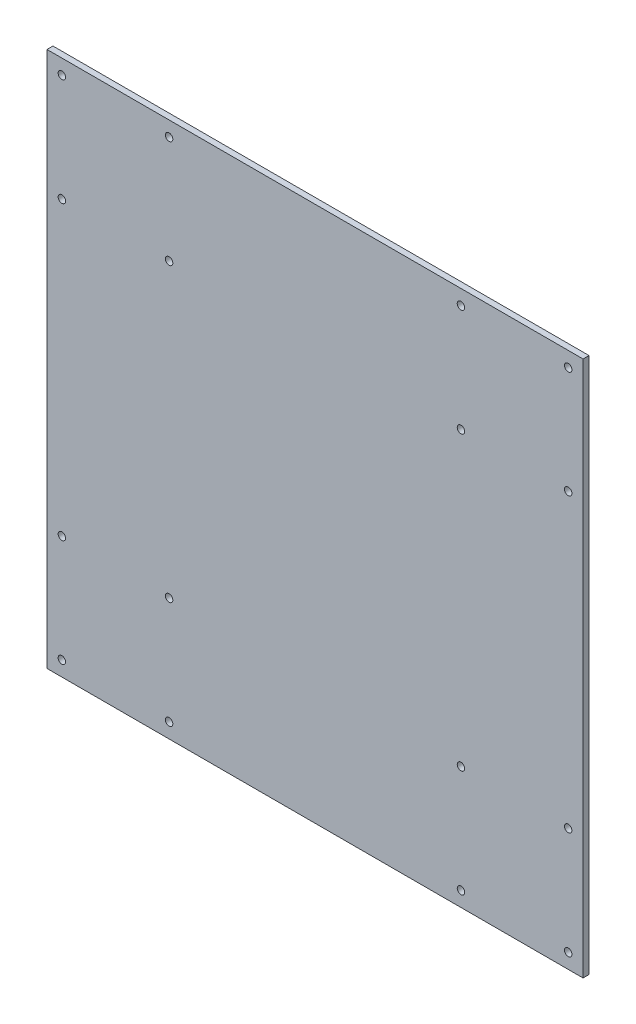
ISO-10303-21;
HEADER;
FILE_DESCRIPTION(('STEP AP214'),'2;1');
FILE_NAME('part.step','',(''),(''),'','','');
FILE_SCHEMA(('AUTOMOTIVE_DESIGN { 1 0 10303 214 1 1 1 1 }'));
ENDSEC;
DATA;
#1=APPLICATION_CONTEXT('core data for automotive mechanical design processes');
#2=APPLICATION_PROTOCOL_DEFINITION('international standard','automotive_design',2000,#1);
#3=PRODUCT_CONTEXT('',#1,'mechanical');
#4=PRODUCT('Part','Part','',(#3));
#5=PRODUCT_RELATED_PRODUCT_CATEGORY('part','',(#4));
#6=PRODUCT_DEFINITION_FORMATION('','',#4);
#7=PRODUCT_DEFINITION_CONTEXT('part definition',#1,'design');
#8=PRODUCT_DEFINITION('design','',#6,#7);
#9=PRODUCT_DEFINITION_SHAPE('','',#8);
#10=(LENGTH_UNIT() NAMED_UNIT(*) SI_UNIT(.MILLI.,.METRE.));
#11=(NAMED_UNIT(*) PLANE_ANGLE_UNIT() SI_UNIT($,.RADIAN.));
#12=(NAMED_UNIT(*) SI_UNIT($,.STERADIAN.) SOLID_ANGLE_UNIT());
#13=UNCERTAINTY_MEASURE_WITH_UNIT(LENGTH_MEASURE(1.E-05),#10,'distance_accuracy_value','');
#14=(GEOMETRIC_REPRESENTATION_CONTEXT(3) GLOBAL_UNCERTAINTY_ASSIGNED_CONTEXT((#13)) GLOBAL_UNIT_ASSIGNED_CONTEXT((#10,
#11,#12)) REPRESENTATION_CONTEXT('',''));
#15=CARTESIAN_POINT('',(0.,0.,0.));
#16=DIRECTION('',(0.,0.,1.));
#17=DIRECTION('',(1.,0.,0.));
#18=AXIS2_PLACEMENT_3D('',#15,#16,#17);
#19=CARTESIAN_POINT('',(0.,0.,0.));
#20=DIRECTION('',(0.,0.,-1.));
#21=DIRECTION('',(-1.,0.,0.));
#22=AXIS2_PLACEMENT_3D('',#19,#20,#21);
#23=PLANE('',#22);
#24=CARTESIAN_POINT('',(5.,41.,0.));
#25=DIRECTION('',(0.,0.,1.));
#26=DIRECTION('',(1.,0.,0.));
#27=AXIS2_PLACEMENT_3D('',#24,#25,#26);
#28=CIRCLE('',#27,1.24999999999999);
#29=CARTESIAN_POINT('',(6.24999999999999,41.,0.));
#30=VERTEX_POINT('',#29);
#31=EDGE_CURVE('E197',#30,#30,#28,.T.);
#32=ORIENTED_EDGE('',*,*,#31,.T.);
#33=EDGE_LOOP('',(#32));
#34=FACE_BOUND('',#33,.T.);
#35=CARTESIAN_POINT('',(41.,4.99999999999996,0.));
#36=DIRECTION('',(0.,0.,1.));
#37=DIRECTION('',(1.,0.,0.));
#38=AXIS2_PLACEMENT_3D('',#35,#36,#37);
#39=CIRCLE('',#38,1.24999999999999);
#40=CARTESIAN_POINT('',(42.25,4.99999999999996,0.));
#41=VERTEX_POINT('',#40);
#42=EDGE_CURVE('E185',#41,#41,#39,.T.);
#43=ORIENTED_EDGE('',*,*,#42,.T.);
#44=EDGE_LOOP('',(#43));
#45=FACE_BOUND('',#44,.T.);
#46=CARTESIAN_POINT('',(5.,139.,0.));
#47=DIRECTION('',(0.,0.,1.));
#48=DIRECTION('',(1.,0.,0.));
#49=AXIS2_PLACEMENT_3D('',#46,#47,#48);
#50=CIRCLE('',#49,1.24999999999999);
#51=CARTESIAN_POINT('',(6.24999999999999,139.,0.));
#52=VERTEX_POINT('',#51);
#53=EDGE_CURVE('E173',#52,#52,#50,.T.);
#54=ORIENTED_EDGE('',*,*,#53,.T.);
#55=EDGE_LOOP('',(#54));
#56=FACE_BOUND('',#55,.T.);
#57=CARTESIAN_POINT('',(41.,175.,0.));
#58=DIRECTION('',(0.,0.,1.));
#59=DIRECTION('',(1.,0.,0.));
#60=AXIS2_PLACEMENT_3D('',#57,#58,#59);
#61=CIRCLE('',#60,1.24999999999999);
#62=CARTESIAN_POINT('',(42.25,175.,0.));
#63=VERTEX_POINT('',#62);
#64=EDGE_CURVE('E161',#63,#63,#61,.T.);
#65=ORIENTED_EDGE('',*,*,#64,.T.);
#66=EDGE_LOOP('',(#65));
#67=FACE_BOUND('',#66,.T.);
#68=CARTESIAN_POINT('',(139.,139.,0.));
#69=DIRECTION('',(0.,0.,1.));
#70=DIRECTION('',(1.,0.,0.));
#71=AXIS2_PLACEMENT_3D('',#68,#69,#70);
#72=CIRCLE('',#71,1.24999999999997);
#73=CARTESIAN_POINT('',(140.25,139.,0.));
#74=VERTEX_POINT('',#73);
#75=EDGE_CURVE('E143',#74,#74,#72,.T.);
#76=ORIENTED_EDGE('',*,*,#75,.T.);
#77=EDGE_LOOP('',(#76));
#78=FACE_BOUND('',#77,.T.);
#79=CARTESIAN_POINT('',(139.,175.,0.));
#80=DIRECTION('',(0.,0.,1.));
#81=DIRECTION('',(1.,0.,0.));
#82=AXIS2_PLACEMENT_3D('',#79,#80,#81);
#83=CIRCLE('',#82,1.25);
#84=CARTESIAN_POINT('',(140.25,175.,0.));
#85=VERTEX_POINT('',#84);
#86=EDGE_CURVE('E137',#85,#85,#83,.T.);
#87=ORIENTED_EDGE('',*,*,#86,.T.);
#88=EDGE_LOOP('',(#87));
#89=FACE_BOUND('',#88,.T.);
#90=CARTESIAN_POINT('',(175.,5.,0.));
#91=DIRECTION('',(0.,0.,1.));
#92=DIRECTION('',(1.,0.,0.));
#93=AXIS2_PLACEMENT_3D('',#90,#91,#92);
#94=CIRCLE('',#93,1.24999999999997);
#95=CARTESIAN_POINT('',(176.25,5.,0.));
#96=VERTEX_POINT('',#95);
#97=EDGE_CURVE('E131',#96,#96,#94,.T.);
#98=ORIENTED_EDGE('',*,*,#97,.T.);
#99=EDGE_LOOP('',(#98));
#100=FACE_BOUND('',#99,.T.);
#101=CARTESIAN_POINT('',(175.,41.,0.));
#102=DIRECTION('',(0.,0.,1.));
#103=DIRECTION('',(1.,0.,0.));
#104=AXIS2_PLACEMENT_3D('',#101,#102,#103);
#105=CIRCLE('',#104,1.24999999999997);
#106=CARTESIAN_POINT('',(176.25,41.,0.));
#107=VERTEX_POINT('',#106);
#108=EDGE_CURVE('E125',#107,#107,#105,.T.);
#109=ORIENTED_EDGE('',*,*,#108,.T.);
#110=EDGE_LOOP('',(#109));
#111=FACE_BOUND('',#110,.T.);
#112=CARTESIAN_POINT('',(139.,41.,0.));
#113=DIRECTION('',(0.,0.,1.));
#114=DIRECTION('',(1.,0.,0.));
#115=AXIS2_PLACEMENT_3D('',#112,#113,#114);
#116=CIRCLE('',#115,1.24999999999997);
#117=CARTESIAN_POINT('',(140.25,41.,0.));
#118=VERTEX_POINT('',#117);
#119=EDGE_CURVE('E119',#118,#118,#116,.T.);
#120=ORIENTED_EDGE('',*,*,#119,.T.);
#121=EDGE_LOOP('',(#120));
#122=FACE_BOUND('',#121,.T.);
#123=CARTESIAN_POINT('',(139.,4.99999999999996,0.));
#124=DIRECTION('',(0.,0.,1.));
#125=DIRECTION('',(1.,0.,0.));
#126=AXIS2_PLACEMENT_3D('',#123,#124,#125);
#127=CIRCLE('',#126,1.25);
#128=CARTESIAN_POINT('',(140.25,4.99999999999996,0.));
#129=VERTEX_POINT('',#128);
#130=EDGE_CURVE('E103',#129,#129,#127,.T.);
#131=ORIENTED_EDGE('',*,*,#130,.T.);
#132=EDGE_LOOP('',(#131));
#133=FACE_BOUND('',#132,.T.);
#134=DIRECTION('',(0.,-1.,0.));
#135=VECTOR('',#134,1.);
#136=CARTESIAN_POINT('',(0.,0.,0.));
#137=LINE('',#136,#135);
#138=CARTESIAN_POINT('',(0.,180.,0.));
#139=VERTEX_POINT('',#138);
#140=CARTESIAN_POINT('',(0.,0.,0.));
#141=VERTEX_POINT('',#140);
#142=EDGE_CURVE('E100',#139,#141,#137,.T.);
#143=ORIENTED_EDGE('',*,*,#142,.F.);
#144=DIRECTION('',(-1.,0.,0.));
#145=VECTOR('',#144,1.);
#146=CARTESIAN_POINT('',(0.,180.,0.));
#147=LINE('',#146,#145);
#148=CARTESIAN_POINT('',(180.,180.,0.));
#149=VERTEX_POINT('',#148);
#150=EDGE_CURVE('E75',#149,#139,#147,.T.);
#151=ORIENTED_EDGE('',*,*,#150,.F.);
#152=DIRECTION('',(0.,1.,0.));
#153=VECTOR('',#152,1.);
#154=CARTESIAN_POINT('',(180.,0.,0.));
#155=LINE('',#154,#153);
#156=CARTESIAN_POINT('',(180.,0.,0.));
#157=VERTEX_POINT('',#156);
#158=EDGE_CURVE('E69',#157,#149,#155,.T.);
#159=ORIENTED_EDGE('',*,*,#158,.F.);
#160=DIRECTION('',(1.,0.,0.));
#161=VECTOR('',#160,1.);
#162=CARTESIAN_POINT('',(0.,0.,0.));
#163=LINE('',#162,#161);
#164=EDGE_CURVE('E92',#141,#157,#163,.T.);
#165=ORIENTED_EDGE('',*,*,#164,.F.);
#166=EDGE_LOOP('',(#143,#151,#159,#165));
#167=FACE_BOUND('',#166,.T.);
#168=CARTESIAN_POINT('',(175.,139.,0.));
#169=DIRECTION('',(0.,0.,1.));
#170=DIRECTION('',(1.,0.,0.));
#171=AXIS2_PLACEMENT_3D('',#168,#169,#170);
#172=CIRCLE('',#171,1.24999999999997);
#173=CARTESIAN_POINT('',(176.25,139.,0.));
#174=VERTEX_POINT('',#173);
#175=EDGE_CURVE('E149',#174,#174,#172,.T.);
#176=ORIENTED_EDGE('',*,*,#175,.T.);
#177=EDGE_LOOP('',(#176));
#178=FACE_BOUND('',#177,.T.);
#179=CARTESIAN_POINT('',(175.,175.,0.));
#180=DIRECTION('',(0.,0.,1.));
#181=DIRECTION('',(1.,0.,0.));
#182=AXIS2_PLACEMENT_3D('',#179,#180,#181);
#183=CIRCLE('',#182,1.24999999999997);
#184=CARTESIAN_POINT('',(176.25,175.,0.));
#185=VERTEX_POINT('',#184);
#186=EDGE_CURVE('E155',#185,#185,#183,.T.);
#187=ORIENTED_EDGE('',*,*,#186,.T.);
#188=EDGE_LOOP('',(#187));
#189=FACE_BOUND('',#188,.T.);
#190=CARTESIAN_POINT('',(41.,139.,0.));
#191=DIRECTION('',(0.,0.,1.));
#192=DIRECTION('',(1.,0.,0.));
#193=AXIS2_PLACEMENT_3D('',#190,#191,#192);
#194=CIRCLE('',#193,1.24999999999999);
#195=CARTESIAN_POINT('',(42.25,139.,0.));
#196=VERTEX_POINT('',#195);
#197=EDGE_CURVE('E167',#196,#196,#194,.T.);
#198=ORIENTED_EDGE('',*,*,#197,.T.);
#199=EDGE_LOOP('',(#198));
#200=FACE_BOUND('',#199,.T.);
#201=CARTESIAN_POINT('',(5.,175.,0.));
#202=DIRECTION('',(0.,0.,1.));
#203=DIRECTION('',(1.,0.,0.));
#204=AXIS2_PLACEMENT_3D('',#201,#202,#203);
#205=CIRCLE('',#204,1.24999999999999);
#206=CARTESIAN_POINT('',(6.24999999999999,175.,0.));
#207=VERTEX_POINT('',#206);
#208=EDGE_CURVE('E179',#207,#207,#205,.T.);
#209=ORIENTED_EDGE('',*,*,#208,.T.);
#210=EDGE_LOOP('',(#209));
#211=FACE_BOUND('',#210,.T.);
#212=CARTESIAN_POINT('',(41.,41.,0.));
#213=DIRECTION('',(0.,0.,1.));
#214=DIRECTION('',(1.,0.,0.));
#215=AXIS2_PLACEMENT_3D('',#212,#213,#214);
#216=CIRCLE('',#215,1.24999999999999);
#217=CARTESIAN_POINT('',(42.25,41.,0.));
#218=VERTEX_POINT('',#217);
#219=EDGE_CURVE('E191',#218,#218,#216,.T.);
#220=ORIENTED_EDGE('',*,*,#219,.T.);
#221=EDGE_LOOP('',(#220));
#222=FACE_BOUND('',#221,.T.);
#223=CARTESIAN_POINT('',(5.,5.,0.));
#224=DIRECTION('',(0.,0.,1.));
#225=DIRECTION('',(1.,0.,0.));
#226=AXIS2_PLACEMENT_3D('',#223,#224,#225);
#227=CIRCLE('',#226,1.24999999999999);
#228=CARTESIAN_POINT('',(6.24999999999999,5.,0.));
#229=VERTEX_POINT('',#228);
#230=EDGE_CURVE('E203',#229,#229,#227,.T.);
#231=ORIENTED_EDGE('',*,*,#230,.T.);
#232=EDGE_LOOP('',(#231));
#233=FACE_BOUND('',#232,.T.);
#234=ADVANCED_FACE('F35',(#34,#45,#56,#67,#78,#89,#100,#111,#122,#133,#167,#178,#189,#200,#211,
#222,#233),#23,.T.);
#235=CARTESIAN_POINT('',(0.,0.,2.));
#236=DIRECTION('',(0.,0.,-1.));
#237=DIRECTION('',(-1.,0.,0.));
#238=AXIS2_PLACEMENT_3D('',#235,#236,#237);
#239=PLANE('',#238);
#240=CARTESIAN_POINT('',(41.,175.,2.));
#241=DIRECTION('',(0.,0.,1.));
#242=DIRECTION('',(1.,0.,0.));
#243=AXIS2_PLACEMENT_3D('',#240,#241,#242);
#244=CIRCLE('',#243,1.24999999999999);
#245=CARTESIAN_POINT('',(42.25,175.,2.));
#246=VERTEX_POINT('',#245);
#247=EDGE_CURVE('E164',#246,#246,#244,.T.);
#248=ORIENTED_EDGE('',*,*,#247,.F.);
#249=EDGE_LOOP('',(#248));
#250=FACE_BOUND('',#249,.T.);
#251=CARTESIAN_POINT('',(175.,139.,2.));
#252=DIRECTION('',(0.,0.,1.));
#253=DIRECTION('',(1.,0.,0.));
#254=AXIS2_PLACEMENT_3D('',#251,#252,#253);
#255=CIRCLE('',#254,1.24999999999997);
#256=CARTESIAN_POINT('',(176.25,139.,2.));
#257=VERTEX_POINT('',#256);
#258=EDGE_CURVE('E152',#257,#257,#255,.T.);
#259=ORIENTED_EDGE('',*,*,#258,.F.);
#260=EDGE_LOOP('',(#259));
#261=FACE_BOUND('',#260,.T.);
#262=CARTESIAN_POINT('',(139.,175.,2.));
#263=DIRECTION('',(0.,0.,1.));
#264=DIRECTION('',(1.,0.,0.));
#265=AXIS2_PLACEMENT_3D('',#262,#263,#264);
#266=CIRCLE('',#265,1.25);
#267=CARTESIAN_POINT('',(140.25,175.,2.));
#268=VERTEX_POINT('',#267);
#269=EDGE_CURVE('E140',#268,#268,#266,.T.);
#270=ORIENTED_EDGE('',*,*,#269,.F.);
#271=EDGE_LOOP('',(#270));
#272=FACE_BOUND('',#271,.T.);
#273=CARTESIAN_POINT('',(175.,5.,2.));
#274=DIRECTION('',(0.,0.,1.));
#275=DIRECTION('',(1.,0.,0.));
#276=AXIS2_PLACEMENT_3D('',#273,#274,#275);
#277=CIRCLE('',#276,1.24999999999997);
#278=CARTESIAN_POINT('',(176.25,5.,2.));
#279=VERTEX_POINT('',#278);
#280=EDGE_CURVE('E134',#279,#279,#277,.T.);
#281=ORIENTED_EDGE('',*,*,#280,.F.);
#282=EDGE_LOOP('',(#281));
#283=FACE_BOUND('',#282,.T.);
#284=CARTESIAN_POINT('',(175.,41.,2.));
#285=DIRECTION('',(0.,0.,1.));
#286=DIRECTION('',(1.,0.,0.));
#287=AXIS2_PLACEMENT_3D('',#284,#285,#286);
#288=CIRCLE('',#287,1.24999999999997);
#289=CARTESIAN_POINT('',(176.25,41.,2.));
#290=VERTEX_POINT('',#289);
#291=EDGE_CURVE('E128',#290,#290,#288,.T.);
#292=ORIENTED_EDGE('',*,*,#291,.F.);
#293=EDGE_LOOP('',(#292));
#294=FACE_BOUND('',#293,.T.);
#295=CARTESIAN_POINT('',(139.,41.,2.));
#296=DIRECTION('',(0.,0.,1.));
#297=DIRECTION('',(1.,0.,0.));
#298=AXIS2_PLACEMENT_3D('',#295,#296,#297);
#299=CIRCLE('',#298,1.24999999999997);
#300=CARTESIAN_POINT('',(140.25,41.,2.));
#301=VERTEX_POINT('',#300);
#302=EDGE_CURVE('E122',#301,#301,#299,.T.);
#303=ORIENTED_EDGE('',*,*,#302,.F.);
#304=EDGE_LOOP('',(#303));
#305=FACE_BOUND('',#304,.T.);
#306=CARTESIAN_POINT('',(139.,4.99999999999996,2.));
#307=DIRECTION('',(0.,0.,1.));
#308=DIRECTION('',(1.,0.,0.));
#309=AXIS2_PLACEMENT_3D('',#306,#307,#308);
#310=CIRCLE('',#309,1.25);
#311=CARTESIAN_POINT('',(140.25,4.99999999999996,2.));
#312=VERTEX_POINT('',#311);
#313=EDGE_CURVE('E116',#312,#312,#310,.T.);
#314=ORIENTED_EDGE('',*,*,#313,.F.);
#315=EDGE_LOOP('',(#314));
#316=FACE_BOUND('',#315,.T.);
#317=DIRECTION('',(0.,-1.,0.));
#318=VECTOR('',#317,1.);
#319=CARTESIAN_POINT('',(0.,0.,2.));
#320=LINE('',#319,#318);
#321=CARTESIAN_POINT('',(0.,180.,2.));
#322=VERTEX_POINT('',#321);
#323=CARTESIAN_POINT('',(0.,0.,2.));
#324=VERTEX_POINT('',#323);
#325=EDGE_CURVE('E88',#322,#324,#320,.T.);
#326=ORIENTED_EDGE('',*,*,#325,.T.);
#327=DIRECTION('',(1.,0.,0.));
#328=VECTOR('',#327,1.);
#329=CARTESIAN_POINT('',(0.,0.,2.));
#330=LINE('',#329,#328);
#331=CARTESIAN_POINT('',(180.,0.,2.));
#332=VERTEX_POINT('',#331);
#333=EDGE_CURVE('E82',#324,#332,#330,.T.);
#334=ORIENTED_EDGE('',*,*,#333,.T.);
#335=DIRECTION('',(0.,1.,0.));
#336=VECTOR('',#335,1.);
#337=CARTESIAN_POINT('',(180.,0.,2.));
#338=LINE('',#337,#336);
#339=CARTESIAN_POINT('',(180.,180.,2.));
#340=VERTEX_POINT('',#339);
#341=EDGE_CURVE('E86',#332,#340,#338,.T.);
#342=ORIENTED_EDGE('',*,*,#341,.T.);
#343=DIRECTION('',(-1.,0.,0.));
#344=VECTOR('',#343,1.);
#345=CARTESIAN_POINT('',(0.,180.,2.));
#346=LINE('',#345,#344);
#347=EDGE_CURVE('E52',#340,#322,#346,.T.);
#348=ORIENTED_EDGE('',*,*,#347,.T.);
#349=EDGE_LOOP('',(#326,#334,#342,#348));
#350=FACE_BOUND('',#349,.T.);
#351=CARTESIAN_POINT('',(139.,139.,2.));
#352=DIRECTION('',(0.,0.,1.));
#353=DIRECTION('',(1.,0.,0.));
#354=AXIS2_PLACEMENT_3D('',#351,#352,#353);
#355=CIRCLE('',#354,1.24999999999997);
#356=CARTESIAN_POINT('',(140.25,139.,2.));
#357=VERTEX_POINT('',#356);
#358=EDGE_CURVE('E146',#357,#357,#355,.T.);
#359=ORIENTED_EDGE('',*,*,#358,.F.);
#360=EDGE_LOOP('',(#359));
#361=FACE_BOUND('',#360,.T.);
#362=CARTESIAN_POINT('',(175.,175.,2.));
#363=DIRECTION('',(0.,0.,1.));
#364=DIRECTION('',(1.,0.,0.));
#365=AXIS2_PLACEMENT_3D('',#362,#363,#364);
#366=CIRCLE('',#365,1.24999999999997);
#367=CARTESIAN_POINT('',(176.25,175.,2.));
#368=VERTEX_POINT('',#367);
#369=EDGE_CURVE('E158',#368,#368,#366,.T.);
#370=ORIENTED_EDGE('',*,*,#369,.F.);
#371=EDGE_LOOP('',(#370));
#372=FACE_BOUND('',#371,.T.);
#373=CARTESIAN_POINT('',(41.,139.,2.));
#374=DIRECTION('',(0.,0.,1.));
#375=DIRECTION('',(1.,0.,0.));
#376=AXIS2_PLACEMENT_3D('',#373,#374,#375);
#377=CIRCLE('',#376,1.24999999999999);
#378=CARTESIAN_POINT('',(42.25,139.,2.));
#379=VERTEX_POINT('',#378);
#380=EDGE_CURVE('E170',#379,#379,#377,.T.);
#381=ORIENTED_EDGE('',*,*,#380,.F.);
#382=EDGE_LOOP('',(#381));
#383=FACE_BOUND('',#382,.T.);
#384=CARTESIAN_POINT('',(5.,139.,2.));
#385=DIRECTION('',(0.,0.,1.));
#386=DIRECTION('',(1.,0.,0.));
#387=AXIS2_PLACEMENT_3D('',#384,#385,#386);
#388=CIRCLE('',#387,1.24999999999999);
#389=CARTESIAN_POINT('',(6.24999999999999,139.,2.));
#390=VERTEX_POINT('',#389);
#391=EDGE_CURVE('E176',#390,#390,#388,.T.);
#392=ORIENTED_EDGE('',*,*,#391,.F.);
#393=EDGE_LOOP('',(#392));
#394=FACE_BOUND('',#393,.T.);
#395=CARTESIAN_POINT('',(5.,175.,2.));
#396=DIRECTION('',(0.,0.,1.));
#397=DIRECTION('',(1.,0.,0.));
#398=AXIS2_PLACEMENT_3D('',#395,#396,#397);
#399=CIRCLE('',#398,1.24999999999999);
#400=CARTESIAN_POINT('',(6.24999999999999,175.,2.));
#401=VERTEX_POINT('',#400);
#402=EDGE_CURVE('E182',#401,#401,#399,.T.);
#403=ORIENTED_EDGE('',*,*,#402,.F.);
#404=EDGE_LOOP('',(#403));
#405=FACE_BOUND('',#404,.T.);
#406=CARTESIAN_POINT('',(41.,4.99999999999996,2.));
#407=DIRECTION('',(0.,0.,1.));
#408=DIRECTION('',(1.,0.,0.));
#409=AXIS2_PLACEMENT_3D('',#406,#407,#408);
#410=CIRCLE('',#409,1.24999999999999);
#411=CARTESIAN_POINT('',(42.25,4.99999999999996,2.));
#412=VERTEX_POINT('',#411);
#413=EDGE_CURVE('E188',#412,#412,#410,.T.);
#414=ORIENTED_EDGE('',*,*,#413,.F.);
#415=EDGE_LOOP('',(#414));
#416=FACE_BOUND('',#415,.T.);
#417=CARTESIAN_POINT('',(41.,41.,2.));
#418=DIRECTION('',(0.,0.,1.));
#419=DIRECTION('',(1.,0.,0.));
#420=AXIS2_PLACEMENT_3D('',#417,#418,#419);
#421=CIRCLE('',#420,1.24999999999999);
#422=CARTESIAN_POINT('',(42.25,41.,2.));
#423=VERTEX_POINT('',#422);
#424=EDGE_CURVE('E194',#423,#423,#421,.T.);
#425=ORIENTED_EDGE('',*,*,#424,.F.);
#426=EDGE_LOOP('',(#425));
#427=FACE_BOUND('',#426,.T.);
#428=CARTESIAN_POINT('',(5.,41.,2.));
#429=DIRECTION('',(0.,0.,1.));
#430=DIRECTION('',(1.,0.,0.));
#431=AXIS2_PLACEMENT_3D('',#428,#429,#430);
#432=CIRCLE('',#431,1.24999999999999);
#433=CARTESIAN_POINT('',(6.24999999999999,41.,2.));
#434=VERTEX_POINT('',#433);
#435=EDGE_CURVE('E200',#434,#434,#432,.T.);
#436=ORIENTED_EDGE('',*,*,#435,.F.);
#437=EDGE_LOOP('',(#436));
#438=FACE_BOUND('',#437,.T.);
#439=CARTESIAN_POINT('',(5.,5.,2.));
#440=DIRECTION('',(0.,0.,1.));
#441=DIRECTION('',(1.,0.,0.));
#442=AXIS2_PLACEMENT_3D('',#439,#440,#441);
#443=CIRCLE('',#442,1.24999999999999);
#444=CARTESIAN_POINT('',(6.24999999999999,5.,2.));
#445=VERTEX_POINT('',#444);
#446=EDGE_CURVE('E206',#445,#445,#443,.T.);
#447=ORIENTED_EDGE('',*,*,#446,.F.);
#448=EDGE_LOOP('',(#447));
#449=FACE_BOUND('',#448,.T.);
#450=ADVANCED_FACE('F83',(#250,#261,#272,#283,#294,#305,#316,#350,#361,#372,#383,#394,#405,#416,
#427,#438,#449),#239,.F.);
#451=CARTESIAN_POINT('',(0.,0.,2.));
#452=DIRECTION('',(1.,0.,0.));
#453=DIRECTION('',(0.,0.,-1.));
#454=AXIS2_PLACEMENT_3D('',#451,#452,#453);
#455=PLANE('',#454);
#456=ORIENTED_EDGE('',*,*,#142,.T.);
#457=DIRECTION('',(0.,0.,-1.));
#458=VECTOR('',#457,1.);
#459=CARTESIAN_POINT('',(0.,0.,2.));
#460=LINE('',#459,#458);
#461=EDGE_CURVE('E11',#324,#141,#460,.T.);
#462=ORIENTED_EDGE('',*,*,#461,.F.);
#463=ORIENTED_EDGE('',*,*,#325,.F.);
#464=DIRECTION('',(0.,0.,-1.));
#465=VECTOR('',#464,1.);
#466=CARTESIAN_POINT('',(0.,180.,2.));
#467=LINE('',#466,#465);
#468=EDGE_CURVE('E96',#322,#139,#467,.T.);
#469=ORIENTED_EDGE('',*,*,#468,.T.);
#470=EDGE_LOOP('',(#456,#462,#463,#469));
#471=FACE_BOUND('',#470,.T.);
#472=ADVANCED_FACE('F37',(#471),#455,.F.);
#473=CARTESIAN_POINT('',(0.,0.,2.));
#474=DIRECTION('',(0.,1.,0.));
#475=DIRECTION('',(-1.,0.,0.));
#476=AXIS2_PLACEMENT_3D('',#473,#474,#475);
#477=PLANE('',#476);
#478=ORIENTED_EDGE('',*,*,#164,.T.);
#479=DIRECTION('',(0.,0.,-1.));
#480=VECTOR('',#479,1.);
#481=CARTESIAN_POINT('',(180.,0.,2.));
#482=LINE('',#481,#480);
#483=EDGE_CURVE('E44',#332,#157,#482,.T.);
#484=ORIENTED_EDGE('',*,*,#483,.F.);
#485=ORIENTED_EDGE('',*,*,#333,.F.);
#486=ORIENTED_EDGE('',*,*,#461,.T.);
#487=EDGE_LOOP('',(#478,#484,#485,#486));
#488=FACE_BOUND('',#487,.T.);
#489=ADVANCED_FACE('F91',(#488),#477,.F.);
#490=CARTESIAN_POINT('',(180.,0.,2.));
#491=DIRECTION('',(-1.,0.,0.));
#492=DIRECTION('',(0.,0.,1.));
#493=AXIS2_PLACEMENT_3D('',#490,#491,#492);
#494=PLANE('',#493);
#495=ORIENTED_EDGE('',*,*,#158,.T.);
#496=DIRECTION('',(0.,0.,-1.));
#497=VECTOR('',#496,1.);
#498=CARTESIAN_POINT('',(180.,180.,2.));
#499=LINE('',#498,#497);
#500=EDGE_CURVE('E93',#340,#149,#499,.T.);
#501=ORIENTED_EDGE('',*,*,#500,.F.);
#502=ORIENTED_EDGE('',*,*,#341,.F.);
#503=ORIENTED_EDGE('',*,*,#483,.T.);
#504=EDGE_LOOP('',(#495,#501,#502,#503));
#505=FACE_BOUND('',#504,.T.);
#506=ADVANCED_FACE('F94',(#505),#494,.F.);
#507=CARTESIAN_POINT('',(0.,180.,2.));
#508=DIRECTION('',(0.,-1.,0.));
#509=DIRECTION('',(1.,0.,0.));
#510=AXIS2_PLACEMENT_3D('',#507,#508,#509);
#511=PLANE('',#510);
#512=ORIENTED_EDGE('',*,*,#150,.T.);
#513=ORIENTED_EDGE('',*,*,#468,.F.);
#514=ORIENTED_EDGE('',*,*,#347,.F.);
#515=ORIENTED_EDGE('',*,*,#500,.T.);
#516=EDGE_LOOP('',(#512,#513,#514,#515));
#517=FACE_BOUND('',#516,.T.);
#518=ADVANCED_FACE('F108',(#517),#511,.F.);
#519=CARTESIAN_POINT('',(139.,4.99999999999996,2.));
#520=DIRECTION('',(0.,0.,1.));
#521=DIRECTION('',(1.,0.,0.));
#522=AXIS2_PLACEMENT_3D('',#519,#520,#521);
#523=CYLINDRICAL_SURFACE('',#522,1.25);
#524=ORIENTED_EDGE('',*,*,#130,.F.);
#525=EDGE_LOOP('',(#524));
#526=FACE_BOUND('',#525,.T.);
#527=ORIENTED_EDGE('',*,*,#313,.T.);
#528=EDGE_LOOP('',(#527));
#529=FACE_BOUND('',#528,.T.);
#530=ADVANCED_FACE('F224',(#526,#529),#523,.F.);
#531=CARTESIAN_POINT('',(139.,41.,2.));
#532=DIRECTION('',(0.,0.,1.));
#533=DIRECTION('',(1.,0.,0.));
#534=AXIS2_PLACEMENT_3D('',#531,#532,#533);
#535=CYLINDRICAL_SURFACE('',#534,1.24999999999997);
#536=ORIENTED_EDGE('',*,*,#119,.F.);
#537=EDGE_LOOP('',(#536));
#538=FACE_BOUND('',#537,.T.);
#539=ORIENTED_EDGE('',*,*,#302,.T.);
#540=EDGE_LOOP('',(#539));
#541=FACE_BOUND('',#540,.T.);
#542=ADVANCED_FACE('F250',(#538,#541),#535,.F.);
#543=CARTESIAN_POINT('',(175.,41.,2.));
#544=DIRECTION('',(0.,0.,1.));
#545=DIRECTION('',(1.,0.,0.));
#546=AXIS2_PLACEMENT_3D('',#543,#544,#545);
#547=CYLINDRICAL_SURFACE('',#546,1.24999999999997);
#548=ORIENTED_EDGE('',*,*,#108,.F.);
#549=EDGE_LOOP('',(#548));
#550=FACE_BOUND('',#549,.T.);
#551=ORIENTED_EDGE('',*,*,#291,.T.);
#552=EDGE_LOOP('',(#551));
#553=FACE_BOUND('',#552,.T.);
#554=ADVANCED_FACE('F257',(#550,#553),#547,.F.);
#555=CARTESIAN_POINT('',(175.,5.,2.));
#556=DIRECTION('',(0.,0.,1.));
#557=DIRECTION('',(1.,0.,0.));
#558=AXIS2_PLACEMENT_3D('',#555,#556,#557);
#559=CYLINDRICAL_SURFACE('',#558,1.24999999999997);
#560=ORIENTED_EDGE('',*,*,#97,.F.);
#561=EDGE_LOOP('',(#560));
#562=FACE_BOUND('',#561,.T.);
#563=ORIENTED_EDGE('',*,*,#280,.T.);
#564=EDGE_LOOP('',(#563));
#565=FACE_BOUND('',#564,.T.);
#566=ADVANCED_FACE('F264',(#562,#565),#559,.F.);
#567=CARTESIAN_POINT('',(139.,175.,2.));
#568=DIRECTION('',(0.,0.,1.));
#569=DIRECTION('',(1.,0.,0.));
#570=AXIS2_PLACEMENT_3D('',#567,#568,#569);
#571=CYLINDRICAL_SURFACE('',#570,1.25);
#572=ORIENTED_EDGE('',*,*,#86,.F.);
#573=EDGE_LOOP('',(#572));
#574=FACE_BOUND('',#573,.T.);
#575=ORIENTED_EDGE('',*,*,#269,.T.);
#576=EDGE_LOOP('',(#575));
#577=FACE_BOUND('',#576,.T.);
#578=ADVANCED_FACE('F272',(#574,#577),#571,.F.);
#579=CARTESIAN_POINT('',(139.,139.,2.));
#580=DIRECTION('',(0.,0.,1.));
#581=DIRECTION('',(1.,0.,0.));
#582=AXIS2_PLACEMENT_3D('',#579,#580,#581);
#583=CYLINDRICAL_SURFACE('',#582,1.24999999999997);
#584=ORIENTED_EDGE('',*,*,#75,.F.);
#585=EDGE_LOOP('',(#584));
#586=FACE_BOUND('',#585,.T.);
#587=ORIENTED_EDGE('',*,*,#358,.T.);
#588=EDGE_LOOP('',(#587));
#589=FACE_BOUND('',#588,.T.);
#590=ADVANCED_FACE('F280',(#586,#589),#583,.F.);
#591=CARTESIAN_POINT('',(175.,139.,2.));
#592=DIRECTION('',(0.,0.,1.));
#593=DIRECTION('',(1.,0.,0.));
#594=AXIS2_PLACEMENT_3D('',#591,#592,#593);
#595=CYLINDRICAL_SURFACE('',#594,1.24999999999997);
#596=ORIENTED_EDGE('',*,*,#175,.F.);
#597=EDGE_LOOP('',(#596));
#598=FACE_BOUND('',#597,.T.);
#599=ORIENTED_EDGE('',*,*,#258,.T.);
#600=EDGE_LOOP('',(#599));
#601=FACE_BOUND('',#600,.T.);
#602=ADVANCED_FACE('F289',(#598,#601),#595,.F.);
#603=CARTESIAN_POINT('',(175.,175.,2.));
#604=DIRECTION('',(0.,0.,1.));
#605=DIRECTION('',(1.,0.,0.));
#606=AXIS2_PLACEMENT_3D('',#603,#604,#605);
#607=CYLINDRICAL_SURFACE('',#606,1.24999999999997);
#608=ORIENTED_EDGE('',*,*,#186,.F.);
#609=EDGE_LOOP('',(#608));
#610=FACE_BOUND('',#609,.T.);
#611=ORIENTED_EDGE('',*,*,#369,.T.);
#612=EDGE_LOOP('',(#611));
#613=FACE_BOUND('',#612,.T.);
#614=ADVANCED_FACE('F299',(#610,#613),#607,.F.);
#615=CARTESIAN_POINT('',(41.,175.,2.));
#616=DIRECTION('',(0.,0.,1.));
#617=DIRECTION('',(1.,0.,0.));
#618=AXIS2_PLACEMENT_3D('',#615,#616,#617);
#619=CYLINDRICAL_SURFACE('',#618,1.24999999999999);
#620=ORIENTED_EDGE('',*,*,#64,.F.);
#621=EDGE_LOOP('',(#620));
#622=FACE_BOUND('',#621,.T.);
#623=ORIENTED_EDGE('',*,*,#247,.T.);
#624=EDGE_LOOP('',(#623));
#625=FACE_BOUND('',#624,.T.);
#626=ADVANCED_FACE('F309',(#622,#625),#619,.F.);
#627=CARTESIAN_POINT('',(41.,139.,2.));
#628=DIRECTION('',(0.,0.,1.));
#629=DIRECTION('',(1.,0.,0.));
#630=AXIS2_PLACEMENT_3D('',#627,#628,#629);
#631=CYLINDRICAL_SURFACE('',#630,1.24999999999999);
#632=ORIENTED_EDGE('',*,*,#197,.F.);
#633=EDGE_LOOP('',(#632));
#634=FACE_BOUND('',#633,.T.);
#635=ORIENTED_EDGE('',*,*,#380,.T.);
#636=EDGE_LOOP('',(#635));
#637=FACE_BOUND('',#636,.T.);
#638=ADVANCED_FACE('F318',(#634,#637),#631,.F.);
#639=CARTESIAN_POINT('',(5.,139.,2.));
#640=DIRECTION('',(0.,0.,1.));
#641=DIRECTION('',(1.,0.,0.));
#642=AXIS2_PLACEMENT_3D('',#639,#640,#641);
#643=CYLINDRICAL_SURFACE('',#642,1.24999999999999);
#644=ORIENTED_EDGE('',*,*,#53,.F.);
#645=EDGE_LOOP('',(#644));
#646=FACE_BOUND('',#645,.T.);
#647=ORIENTED_EDGE('',*,*,#391,.T.);
#648=EDGE_LOOP('',(#647));
#649=FACE_BOUND('',#648,.T.);
#650=ADVANCED_FACE('F325',(#646,#649),#643,.F.);
#651=CARTESIAN_POINT('',(5.,175.,2.));
#652=DIRECTION('',(0.,0.,1.));
#653=DIRECTION('',(1.,0.,0.));
#654=AXIS2_PLACEMENT_3D('',#651,#652,#653);
#655=CYLINDRICAL_SURFACE('',#654,1.24999999999999);
#656=ORIENTED_EDGE('',*,*,#208,.F.);
#657=EDGE_LOOP('',(#656));
#658=FACE_BOUND('',#657,.T.);
#659=ORIENTED_EDGE('',*,*,#402,.T.);
#660=EDGE_LOOP('',(#659));
#661=FACE_BOUND('',#660,.T.);
#662=ADVANCED_FACE('F332',(#658,#661),#655,.F.);
#663=CARTESIAN_POINT('',(41.,4.99999999999996,2.));
#664=DIRECTION('',(0.,0.,1.));
#665=DIRECTION('',(1.,0.,0.));
#666=AXIS2_PLACEMENT_3D('',#663,#664,#665);
#667=CYLINDRICAL_SURFACE('',#666,1.24999999999999);
#668=ORIENTED_EDGE('',*,*,#42,.F.);
#669=EDGE_LOOP('',(#668));
#670=FACE_BOUND('',#669,.T.);
#671=ORIENTED_EDGE('',*,*,#413,.T.);
#672=EDGE_LOOP('',(#671));
#673=FACE_BOUND('',#672,.T.);
#674=ADVANCED_FACE('F339',(#670,#673),#667,.F.);
#675=CARTESIAN_POINT('',(41.,41.,2.));
#676=DIRECTION('',(0.,0.,1.));
#677=DIRECTION('',(1.,0.,0.));
#678=AXIS2_PLACEMENT_3D('',#675,#676,#677);
#679=CYLINDRICAL_SURFACE('',#678,1.24999999999999);
#680=ORIENTED_EDGE('',*,*,#219,.F.);
#681=EDGE_LOOP('',(#680));
#682=FACE_BOUND('',#681,.T.);
#683=ORIENTED_EDGE('',*,*,#424,.T.);
#684=EDGE_LOOP('',(#683));
#685=FACE_BOUND('',#684,.T.);
#686=ADVANCED_FACE('F346',(#682,#685),#679,.F.);
#687=CARTESIAN_POINT('',(5.,41.,2.));
#688=DIRECTION('',(0.,0.,1.));
#689=DIRECTION('',(1.,0.,0.));
#690=AXIS2_PLACEMENT_3D('',#687,#688,#689);
#691=CYLINDRICAL_SURFACE('',#690,1.24999999999999);
#692=ORIENTED_EDGE('',*,*,#31,.F.);
#693=EDGE_LOOP('',(#692));
#694=FACE_BOUND('',#693,.T.);
#695=ORIENTED_EDGE('',*,*,#435,.T.);
#696=EDGE_LOOP('',(#695));
#697=FACE_BOUND('',#696,.T.);
#698=ADVANCED_FACE('F353',(#694,#697),#691,.F.);
#699=CARTESIAN_POINT('',(5.,5.,2.));
#700=DIRECTION('',(0.,0.,1.));
#701=DIRECTION('',(1.,0.,0.));
#702=AXIS2_PLACEMENT_3D('',#699,#700,#701);
#703=CYLINDRICAL_SURFACE('',#702,1.24999999999999);
#704=ORIENTED_EDGE('',*,*,#230,.F.);
#705=EDGE_LOOP('',(#704));
#706=FACE_BOUND('',#705,.T.);
#707=ORIENTED_EDGE('',*,*,#446,.T.);
#708=EDGE_LOOP('',(#707));
#709=FACE_BOUND('',#708,.T.);
#710=ADVANCED_FACE('F210',(#706,#709),#703,.F.);
#711=CLOSED_SHELL('',(#234,#450,#472,#489,#506,#518,#530,#542,#554,#566,#578,#590,#602,#614,
#626,#638,#650,#662,#674,#686,#698,#710));
#712=MANIFOLD_SOLID_BREP('B2',#711);
#713=ADVANCED_BREP_SHAPE_REPRESENTATION('',(#18,#712),#14);
#714=SHAPE_DEFINITION_REPRESENTATION(#9,#713);
ENDSEC;
END-ISO-10303-21;
